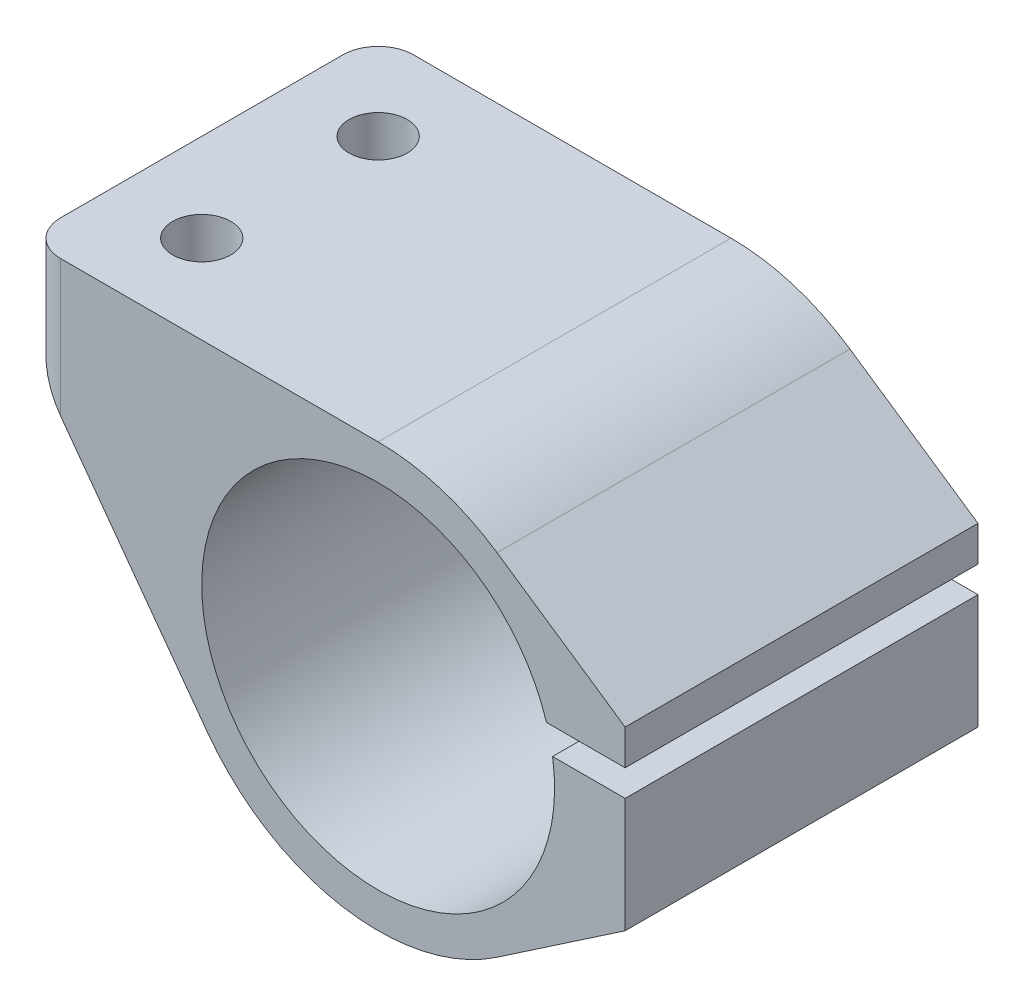
ISO-10303-21;
HEADER;
FILE_DESCRIPTION(('STEP AP214'),'2;1');
FILE_NAME('part.step','',(''),(''),'','','');
FILE_SCHEMA(('AUTOMOTIVE_DESIGN { 1 0 10303 214 1 1 1 1 }'));
ENDSEC;
DATA;
#1=APPLICATION_CONTEXT('core data for automotive mechanical design processes');
#2=APPLICATION_PROTOCOL_DEFINITION('international standard','automotive_design',2000,#1);
#3=PRODUCT_CONTEXT('',#1,'mechanical');
#4=PRODUCT('Part','Part','',(#3));
#5=PRODUCT_RELATED_PRODUCT_CATEGORY('part','',(#4));
#6=PRODUCT_DEFINITION_FORMATION('','',#4);
#7=PRODUCT_DEFINITION_CONTEXT('part definition',#1,'design');
#8=PRODUCT_DEFINITION('design','',#6,#7);
#9=PRODUCT_DEFINITION_SHAPE('','',#8);
#10=(LENGTH_UNIT() NAMED_UNIT(*) SI_UNIT(.MILLI.,.METRE.));
#11=(NAMED_UNIT(*) PLANE_ANGLE_UNIT() SI_UNIT($,.RADIAN.));
#12=(NAMED_UNIT(*) SI_UNIT($,.STERADIAN.) SOLID_ANGLE_UNIT());
#13=UNCERTAINTY_MEASURE_WITH_UNIT(LENGTH_MEASURE(1.E-05),#10,'distance_accuracy_value','');
#14=(GEOMETRIC_REPRESENTATION_CONTEXT(3) GLOBAL_UNCERTAINTY_ASSIGNED_CONTEXT((#13)) GLOBAL_UNIT_ASSIGNED_CONTEXT((#10,
#11,#12)) REPRESENTATION_CONTEXT('',''));
#15=CARTESIAN_POINT('',(0.,0.,0.));
#16=DIRECTION('',(0.,0.,1.));
#17=DIRECTION('',(1.,0.,0.));
#18=AXIS2_PLACEMENT_3D('',#15,#16,#17);
#19=CARTESIAN_POINT('',(0.,0.,20.));
#20=DIRECTION('',(0.,0.,-1.));
#21=DIRECTION('',(-1.,0.,0.));
#22=AXIS2_PLACEMENT_3D('',#19,#20,#21);
#23=CYLINDRICAL_SURFACE('',#22,12.);
#24=DIRECTION('',(0.,0.,1.));
#25=VECTOR('',#24,1.);
#26=CARTESIAN_POINT('',(0.,12.,0.));
#27=LINE('',#26,#25);
#28=CARTESIAN_POINT('',(0.,12.,0.));
#29=VERTEX_POINT('',#28);
#30=CARTESIAN_POINT('',(0.,12.,20.));
#31=VERTEX_POINT('',#30);
#32=EDGE_CURVE('E145',#29,#31,#27,.T.);
#33=ORIENTED_EDGE('',*,*,#32,.T.);
#34=CARTESIAN_POINT('',(0.,0.,20.));
#35=DIRECTION('',(0.,0.,1.));
#36=DIRECTION('',(1.,0.,0.));
#37=AXIS2_PLACEMENT_3D('',#34,#35,#36);
#38=CIRCLE('',#37,12.);
#39=CARTESIAN_POINT('',(6.73982867310621,9.92847971530261,20.));
#40=VERTEX_POINT('',#39);
#41=EDGE_CURVE('E172',#40,#31,#38,.T.);
#42=ORIENTED_EDGE('',*,*,#41,.F.);
#43=DIRECTION('',(0.,0.,-1.));
#44=VECTOR('',#43,1.);
#45=CARTESIAN_POINT('',(6.73982867310621,9.92847971530261,20.));
#46=LINE('',#45,#44);
#47=CARTESIAN_POINT('',(6.73982867310621,9.92847971530261,0.));
#48=VERTEX_POINT('',#47);
#49=EDGE_CURVE('E188',#40,#48,#46,.T.);
#50=ORIENTED_EDGE('',*,*,#49,.T.);
#51=CARTESIAN_POINT('',(0.,0.,0.));
#52=DIRECTION('',(0.,0.,1.));
#53=DIRECTION('',(1.,0.,0.));
#54=AXIS2_PLACEMENT_3D('',#51,#52,#53);
#55=CIRCLE('',#54,12.);
#56=EDGE_CURVE('E156',#48,#29,#55,.T.);
#57=ORIENTED_EDGE('',*,*,#56,.T.);
#58=EDGE_LOOP('',(#33,#42,#50,#57));
#59=FACE_BOUND('',#58,.T.);
#60=ADVANCED_FACE('F33',(#59),#23,.T.);
#61=CARTESIAN_POINT('',(-9.68150764479317,-7.09002184226618,20.));
#62=VERTEX_POINT('',#61);
#63=CARTESIAN_POINT('',(6.7398286731062,-9.92847971530261,20.));
#64=VERTEX_POINT('',#63);
#65=EDGE_CURVE('E160',#62,#64,#38,.T.);
#66=ORIENTED_EDGE('',*,*,#65,.F.);
#67=DIRECTION('',(0.,0.,1.));
#68=VECTOR('',#67,1.);
#69=CARTESIAN_POINT('',(-9.68150764479317,-7.09002184226618,0.));
#70=LINE('',#69,#68);
#71=CARTESIAN_POINT('',(-9.68150764479317,-7.09002184226618,0.));
#72=VERTEX_POINT('',#71);
#73=EDGE_CURVE('E143',#72,#62,#70,.T.);
#74=ORIENTED_EDGE('',*,*,#73,.F.);
#75=CARTESIAN_POINT('',(6.7398286731062,-9.92847971530261,0.));
#76=VERTEX_POINT('',#75);
#77=EDGE_CURVE('E149',#72,#76,#55,.T.);
#78=ORIENTED_EDGE('',*,*,#77,.T.);
#79=DIRECTION('',(0.,0.,-1.));
#80=VECTOR('',#79,1.);
#81=CARTESIAN_POINT('',(6.7398286731062,-9.92847971530261,20.));
#82=LINE('',#81,#80);
#83=EDGE_CURVE('E223',#64,#76,#82,.T.);
#84=ORIENTED_EDGE('',*,*,#83,.F.);
#85=EDGE_LOOP('',(#66,#74,#78,#84));
#86=FACE_BOUND('',#85,.T.);
#87=ADVANCED_FACE('F159',(#86),#23,.T.);
#88=CARTESIAN_POINT('',(6.7398286731062,-9.92847971530261,20.));
#89=DIRECTION('',(-0.561652389425518,0.827373309608551,0.));
#90=DIRECTION('',(-0.827373309608551,-0.561652389425518,0.));
#91=AXIS2_PLACEMENT_3D('',#88,#89,#90);
#92=PLANE('',#91);
#93=DIRECTION('',(0.827373309608551,0.561652389425518,0.));
#94=VECTOR('',#93,1.);
#95=CARTESIAN_POINT('',(6.7398286731062,-9.92847971530261,0.));
#96=LINE('',#95,#94);
#97=CARTESIAN_POINT('',(14.,-5.,0.));
#98=VERTEX_POINT('',#97);
#99=EDGE_CURVE('E152',#76,#98,#96,.T.);
#100=ORIENTED_EDGE('',*,*,#99,.T.);
#101=DIRECTION('',(0.,0.,-1.));
#102=VECTOR('',#101,1.);
#103=CARTESIAN_POINT('',(14.,-5.,20.));
#104=LINE('',#103,#102);
#105=CARTESIAN_POINT('',(14.,-5.,20.));
#106=VERTEX_POINT('',#105);
#107=EDGE_CURVE('E220',#106,#98,#104,.T.);
#108=ORIENTED_EDGE('',*,*,#107,.F.);
#109=DIRECTION('',(0.827373309608551,0.561652389425518,0.));
#110=VECTOR('',#109,1.);
#111=CARTESIAN_POINT('',(6.7398286731062,-9.92847971530261,20.));
#112=LINE('',#111,#110);
#113=EDGE_CURVE('E175',#64,#106,#112,.T.);
#114=ORIENTED_EDGE('',*,*,#113,.F.);
#115=ORIENTED_EDGE('',*,*,#83,.T.);
#116=EDGE_LOOP('',(#100,#108,#114,#115));
#117=FACE_BOUND('',#116,.T.);
#118=ADVANCED_FACE('F260',(#117),#92,.F.);
#119=CARTESIAN_POINT('',(14.,-5.,20.));
#120=DIRECTION('',(-1.,0.,0.));
#121=DIRECTION('',(0.,0.,1.));
#122=AXIS2_PLACEMENT_3D('',#119,#120,#121);
#123=PLANE('',#122);
#124=DIRECTION('',(0.,1.,0.));
#125=VECTOR('',#124,1.);
#126=CARTESIAN_POINT('',(14.,-5.,0.));
#127=LINE('',#126,#125);
#128=CARTESIAN_POINT('',(14.,1.5,0.));
#129=VERTEX_POINT('',#128);
#130=EDGE_CURVE('E191',#98,#129,#127,.T.);
#131=ORIENTED_EDGE('',*,*,#130,.T.);
#132=DIRECTION('',(0.,0.,-1.));
#133=VECTOR('',#132,1.);
#134=CARTESIAN_POINT('',(14.,1.5,20.));
#135=LINE('',#134,#133);
#136=CARTESIAN_POINT('',(14.,1.5,20.));
#137=VERTEX_POINT('',#136);
#138=EDGE_CURVE('E217',#137,#129,#135,.T.);
#139=ORIENTED_EDGE('',*,*,#138,.F.);
#140=DIRECTION('',(0.,1.,0.));
#141=VECTOR('',#140,1.);
#142=CARTESIAN_POINT('',(14.,-5.,20.));
#143=LINE('',#142,#141);
#144=EDGE_CURVE('E177',#106,#137,#143,.T.);
#145=ORIENTED_EDGE('',*,*,#144,.F.);
#146=ORIENTED_EDGE('',*,*,#107,.T.);
#147=EDGE_LOOP('',(#131,#139,#145,#146));
#148=FACE_BOUND('',#147,.T.);
#149=ADVANCED_FACE('F264',(#148),#123,.F.);
#150=CARTESIAN_POINT('',(14.,1.5,20.));
#151=DIRECTION('',(0.,-1.,0.));
#152=DIRECTION('',(1.,0.,0.));
#153=AXIS2_PLACEMENT_3D('',#150,#151,#152);
#154=PLANE('',#153);
#155=DIRECTION('',(-1.,0.,0.));
#156=VECTOR('',#155,1.);
#157=CARTESIAN_POINT('',(14.,1.5,0.));
#158=LINE('',#157,#156);
#159=CARTESIAN_POINT('',(9.88685996664259,1.5,0.));
#160=VERTEX_POINT('',#159);
#161=EDGE_CURVE('E193',#129,#160,#158,.T.);
#162=ORIENTED_EDGE('',*,*,#161,.T.);
#163=DIRECTION('',(0.,0.,-1.));
#164=VECTOR('',#163,1.);
#165=CARTESIAN_POINT('',(9.88685996664259,1.5,20.));
#166=LINE('',#165,#164);
#167=CARTESIAN_POINT('',(9.88685996664259,1.5,20.));
#168=VERTEX_POINT('',#167);
#169=EDGE_CURVE('E214',#168,#160,#166,.T.);
#170=ORIENTED_EDGE('',*,*,#169,.F.);
#171=DIRECTION('',(-1.,0.,0.));
#172=VECTOR('',#171,1.);
#173=CARTESIAN_POINT('',(14.,1.5,20.));
#174=LINE('',#173,#172);
#175=EDGE_CURVE('E179',#137,#168,#174,.T.);
#176=ORIENTED_EDGE('',*,*,#175,.F.);
#177=ORIENTED_EDGE('',*,*,#138,.T.);
#178=EDGE_LOOP('',(#162,#170,#176,#177));
#179=FACE_BOUND('',#178,.T.);
#180=ADVANCED_FACE('F268',(#179),#154,.F.);
#181=CARTESIAN_POINT('',(0.,0.,20.));
#182=DIRECTION('',(0.,0.,-1.));
#183=DIRECTION('',(-1.,0.,0.));
#184=AXIS2_PLACEMENT_3D('',#181,#182,#183);
#185=CYLINDRICAL_SURFACE('',#184,10.);
#186=CARTESIAN_POINT('',(0.,0.,0.));
#187=DIRECTION('',(0.,0.,-1.));
#188=DIRECTION('',(1.,0.,0.));
#189=AXIS2_PLACEMENT_3D('',#186,#187,#188);
#190=CIRCLE('',#189,10.);
#191=CARTESIAN_POINT('',(9.53939201416946,3.,0.));
#192=VERTEX_POINT('',#191);
#193=EDGE_CURVE('E195',#160,#192,#190,.T.);
#194=ORIENTED_EDGE('',*,*,#193,.T.);
#195=DIRECTION('',(0.,0.,-1.));
#196=VECTOR('',#195,1.);
#197=CARTESIAN_POINT('',(9.53939201416946,3.,20.));
#198=LINE('',#197,#196);
#199=CARTESIAN_POINT('',(9.53939201416946,3.,20.));
#200=VERTEX_POINT('',#199);
#201=EDGE_CURVE('E211',#200,#192,#198,.T.);
#202=ORIENTED_EDGE('',*,*,#201,.F.);
#203=CARTESIAN_POINT('',(0.,0.,20.));
#204=DIRECTION('',(0.,0.,-1.));
#205=DIRECTION('',(1.,0.,0.));
#206=AXIS2_PLACEMENT_3D('',#203,#204,#205);
#207=CIRCLE('',#206,10.);
#208=EDGE_CURVE('E181',#168,#200,#207,.T.);
#209=ORIENTED_EDGE('',*,*,#208,.F.);
#210=ORIENTED_EDGE('',*,*,#169,.T.);
#211=EDGE_LOOP('',(#194,#202,#209,#210));
#212=FACE_BOUND('',#211,.T.);
#213=ADVANCED_FACE('F272',(#212),#185,.F.);
#214=CARTESIAN_POINT('',(9.53939201416946,3.,20.));
#215=DIRECTION('',(0.,1.,0.));
#216=DIRECTION('',(-1.,0.,0.));
#217=AXIS2_PLACEMENT_3D('',#214,#215,#216);
#218=PLANE('',#217);
#219=DIRECTION('',(1.,0.,0.));
#220=VECTOR('',#219,1.);
#221=CARTESIAN_POINT('',(9.53939201416946,3.,0.));
#222=LINE('',#221,#220);
#223=CARTESIAN_POINT('',(14.,3.,0.));
#224=VERTEX_POINT('',#223);
#225=EDGE_CURVE('E197',#192,#224,#222,.T.);
#226=ORIENTED_EDGE('',*,*,#225,.T.);
#227=DIRECTION('',(0.,0.,-1.));
#228=VECTOR('',#227,1.);
#229=CARTESIAN_POINT('',(14.,3.,20.));
#230=LINE('',#229,#228);
#231=CARTESIAN_POINT('',(14.,3.,20.));
#232=VERTEX_POINT('',#231);
#233=EDGE_CURVE('E208',#232,#224,#230,.T.);
#234=ORIENTED_EDGE('',*,*,#233,.F.);
#235=DIRECTION('',(1.,0.,0.));
#236=VECTOR('',#235,1.);
#237=CARTESIAN_POINT('',(9.53939201416946,3.,20.));
#238=LINE('',#237,#236);
#239=EDGE_CURVE('E183',#200,#232,#238,.T.);
#240=ORIENTED_EDGE('',*,*,#239,.F.);
#241=ORIENTED_EDGE('',*,*,#201,.T.);
#242=EDGE_LOOP('',(#226,#234,#240,#241));
#243=FACE_BOUND('',#242,.T.);
#244=ADVANCED_FACE('F276',(#243),#218,.F.);
#245=CARTESIAN_POINT('',(14.,3.,20.));
#246=DIRECTION('',(-1.,0.,0.));
#247=DIRECTION('',(0.,0.,1.));
#248=AXIS2_PLACEMENT_3D('',#245,#246,#247);
#249=PLANE('',#248);
#250=DIRECTION('',(0.,1.,0.));
#251=VECTOR('',#250,1.);
#252=CARTESIAN_POINT('',(14.,3.,0.));
#253=LINE('',#252,#251);
#254=CARTESIAN_POINT('',(14.,5.,0.));
#255=VERTEX_POINT('',#254);
#256=EDGE_CURVE('E199',#224,#255,#253,.T.);
#257=ORIENTED_EDGE('',*,*,#256,.T.);
#258=DIRECTION('',(0.,0.,-1.));
#259=VECTOR('',#258,1.);
#260=CARTESIAN_POINT('',(14.,5.,20.));
#261=LINE('',#260,#259);
#262=CARTESIAN_POINT('',(14.,5.,20.));
#263=VERTEX_POINT('',#262);
#264=EDGE_CURVE('E205',#263,#255,#261,.T.);
#265=ORIENTED_EDGE('',*,*,#264,.F.);
#266=DIRECTION('',(0.,1.,0.));
#267=VECTOR('',#266,1.);
#268=CARTESIAN_POINT('',(14.,3.,20.));
#269=LINE('',#268,#267);
#270=EDGE_CURVE('E185',#232,#263,#269,.T.);
#271=ORIENTED_EDGE('',*,*,#270,.F.);
#272=ORIENTED_EDGE('',*,*,#233,.T.);
#273=EDGE_LOOP('',(#257,#265,#271,#272));
#274=FACE_BOUND('',#273,.T.);
#275=ADVANCED_FACE('F280',(#274),#249,.F.);
#276=CARTESIAN_POINT('',(14.,5.,20.));
#277=DIRECTION('',(-0.561652389425517,-0.827373309608551,0.));
#278=DIRECTION('',(0.827373309608551,-0.561652389425517,0.));
#279=AXIS2_PLACEMENT_3D('',#276,#277,#278);
#280=PLANE('',#279);
#281=DIRECTION('',(-0.827373309608551,0.561652389425517,0.));
#282=VECTOR('',#281,1.);
#283=CARTESIAN_POINT('',(14.,5.,0.));
#284=LINE('',#283,#282);
#285=EDGE_CURVE('E201',#255,#48,#284,.T.);
#286=ORIENTED_EDGE('',*,*,#285,.T.);
#287=ORIENTED_EDGE('',*,*,#49,.F.);
#288=DIRECTION('',(-0.827373309608551,0.561652389425517,0.));
#289=VECTOR('',#288,1.);
#290=CARTESIAN_POINT('',(14.,5.,20.));
#291=LINE('',#290,#289);
#292=EDGE_CURVE('E187',#263,#40,#291,.T.);
#293=ORIENTED_EDGE('',*,*,#292,.F.);
#294=ORIENTED_EDGE('',*,*,#264,.T.);
#295=EDGE_LOOP('',(#286,#287,#293,#294));
#296=FACE_BOUND('',#295,.T.);
#297=ADVANCED_FACE('F284',(#296),#280,.F.);
#298=CARTESIAN_POINT('',(0.,0.,20.));
#299=DIRECTION('',(0.,0.,1.));
#300=DIRECTION('',(1.,0.,0.));
#301=AXIS2_PLACEMENT_3D('',#298,#299,#300);
#302=PLANE('',#301);
#303=DIRECTION('',(-1.,0.,0.));
#304=VECTOR('',#303,1.);
#305=CARTESIAN_POINT('',(0.,12.,20.));
#306=LINE('',#305,#304);
#307=CARTESIAN_POINT('',(-18.,12.,20.));
#308=VERTEX_POINT('',#307);
#309=EDGE_CURVE('E324',#31,#308,#306,.T.);
#310=ORIENTED_EDGE('',*,*,#309,.T.);
#311=DIRECTION('',(0.,-1.,0.));
#312=VECTOR('',#311,1.);
#313=CARTESIAN_POINT('',(-18.,0.,20.));
#314=LINE('',#313,#312);
#315=CARTESIAN_POINT('',(-18.,4.26897663782128,20.));
#316=VERTEX_POINT('',#315);
#317=EDGE_CURVE('E11',#308,#316,#314,.T.);
#318=ORIENTED_EDGE('',*,*,#317,.T.);
#319=DIRECTION('',(0.590835153522182,-0.806792303732764,0.));
#320=VECTOR('',#319,1.);
#321=CARTESIAN_POINT('',(-20.,7.,20.));
#322=LINE('',#321,#320);
#323=EDGE_CURVE('E167',#316,#62,#322,.T.);
#324=ORIENTED_EDGE('',*,*,#323,.T.);
#325=ORIENTED_EDGE('',*,*,#65,.T.);
#326=ORIENTED_EDGE('',*,*,#113,.T.);
#327=ORIENTED_EDGE('',*,*,#144,.T.);
#328=ORIENTED_EDGE('',*,*,#175,.T.);
#329=ORIENTED_EDGE('',*,*,#208,.T.);
#330=ORIENTED_EDGE('',*,*,#239,.T.);
#331=ORIENTED_EDGE('',*,*,#270,.T.);
#332=ORIENTED_EDGE('',*,*,#292,.T.);
#333=ORIENTED_EDGE('',*,*,#41,.T.);
#334=EDGE_LOOP('',(#310,#318,#324,#325,#326,#327,#328,#329,#330,#331,#332,#333));
#335=FACE_BOUND('',#334,.T.);
#336=ADVANCED_FACE('F288',(#335),#302,.T.);
#337=CARTESIAN_POINT('',(0.,0.,0.));
#338=DIRECTION('',(0.,0.,1.));
#339=DIRECTION('',(1.,0.,0.));
#340=AXIS2_PLACEMENT_3D('',#337,#338,#339);
#341=PLANE('',#340);
#342=DIRECTION('',(0.590835153522182,-0.806792303732764,0.));
#343=VECTOR('',#342,1.);
#344=CARTESIAN_POINT('',(-20.,7.,0.));
#345=LINE('',#344,#343);
#346=CARTESIAN_POINT('',(-18.,4.26897663782128,0.));
#347=VERTEX_POINT('',#346);
#348=EDGE_CURVE('E137',#347,#72,#345,.T.);
#349=ORIENTED_EDGE('',*,*,#348,.F.);
#350=DIRECTION('',(0.,-1.,0.));
#351=VECTOR('',#350,1.);
#352=CARTESIAN_POINT('',(-18.,12.,0.));
#353=LINE('',#352,#351);
#354=CARTESIAN_POINT('',(-18.,12.,0.));
#355=VERTEX_POINT('',#354);
#356=EDGE_CURVE('E56',#347,#355,#353,.F.);
#357=ORIENTED_EDGE('',*,*,#356,.T.);
#358=DIRECTION('',(-1.,0.,0.));
#359=VECTOR('',#358,1.);
#360=CARTESIAN_POINT('',(0.,12.,0.));
#361=LINE('',#360,#359);
#362=EDGE_CURVE('E146',#29,#355,#361,.T.);
#363=ORIENTED_EDGE('',*,*,#362,.F.);
#364=ORIENTED_EDGE('',*,*,#56,.F.);
#365=ORIENTED_EDGE('',*,*,#285,.F.);
#366=ORIENTED_EDGE('',*,*,#256,.F.);
#367=ORIENTED_EDGE('',*,*,#225,.F.);
#368=ORIENTED_EDGE('',*,*,#193,.F.);
#369=ORIENTED_EDGE('',*,*,#161,.F.);
#370=ORIENTED_EDGE('',*,*,#130,.F.);
#371=ORIENTED_EDGE('',*,*,#99,.F.);
#372=ORIENTED_EDGE('',*,*,#77,.F.);
#373=EDGE_LOOP('',(#349,#357,#363,#364,#365,#366,#367,#368,#369,#370,#371,#372));
#374=FACE_BOUND('',#373,.T.);
#375=ADVANCED_FACE('F150',(#374),#341,.F.);
#376=CARTESIAN_POINT('',(-20.,7.,0.));
#377=DIRECTION('',(-0.806792303732764,-0.590835153522182,0.));
#378=DIRECTION('',(0.590835153522182,-0.806792303732764,0.));
#379=AXIS2_PLACEMENT_3D('',#376,#377,#378);
#380=PLANE('',#379);
#381=CARTESIAN_POINT('',(-15.,0.172441594553206,5.));
#382=DIRECTION('',(-0.806792303732764,-0.590835153522182,0.));
#383=DIRECTION('',(-0.590835153522182,0.806792303732764,0.));
#384=AXIS2_PLACEMENT_3D('',#381,#382,#383);
#385=ELLIPSE('',#384,2.79265712299574,1.65);
#386=CARTESIAN_POINT('',(-16.65,2.42553586835065,5.));
#387=VERTEX_POINT('',#386);
#388=EDGE_CURVE('E321',#387,#387,#385,.T.);
#389=ORIENTED_EDGE('',*,*,#388,.F.);
#390=EDGE_LOOP('',(#389));
#391=FACE_BOUND('',#390,.T.);
#392=CARTESIAN_POINT('',(-15.,0.172441594553206,15.));
#393=DIRECTION('',(-0.806792303732764,-0.590835153522182,0.));
#394=DIRECTION('',(-0.590835153522182,0.806792303732764,0.));
#395=AXIS2_PLACEMENT_3D('',#392,#393,#394);
#396=ELLIPSE('',#395,2.79265712299574,1.65);
#397=CARTESIAN_POINT('',(-16.65,2.42553586835065,15.));
#398=VERTEX_POINT('',#397);
#399=EDGE_CURVE('E310',#398,#398,#396,.T.);
#400=ORIENTED_EDGE('',*,*,#399,.F.);
#401=EDGE_LOOP('',(#400));
#402=FACE_BOUND('',#401,.T.);
#403=DIRECTION('',(0.,0.,1.));
#404=VECTOR('',#403,1.);
#405=CARTESIAN_POINT('',(-20.,7.,0.));
#406=LINE('',#405,#404);
#407=CARTESIAN_POINT('',(-20.,7.,2.));
#408=VERTEX_POINT('',#407);
#409=CARTESIAN_POINT('',(-20.,7.,18.));
#410=VERTEX_POINT('',#409);
#411=EDGE_CURVE('E161',#408,#410,#406,.T.);
#412=ORIENTED_EDGE('',*,*,#411,.F.);
#413=CARTESIAN_POINT('',(-18.,4.26897663782128,2.));
#414=DIRECTION('',(-0.806792303732764,-0.590835153522182,0.));
#415=DIRECTION('',(-0.590835153522182,0.806792303732764,0.));
#416=AXIS2_PLACEMENT_3D('',#413,#414,#415);
#417=ELLIPSE('',#416,3.38503893696453,2.);
#418=EDGE_CURVE('E144',#408,#347,#417,.T.);
#419=ORIENTED_EDGE('',*,*,#418,.T.);
#420=ORIENTED_EDGE('',*,*,#348,.T.);
#421=ORIENTED_EDGE('',*,*,#73,.T.);
#422=ORIENTED_EDGE('',*,*,#323,.F.);
#423=CARTESIAN_POINT('',(-18.,4.26897663782128,18.));
#424=DIRECTION('',(-0.806792303732764,-0.590835153522182,0.));
#425=DIRECTION('',(0.590835153522182,-0.806792303732764,0.));
#426=AXIS2_PLACEMENT_3D('',#423,#424,#425);
#427=ELLIPSE('',#426,3.38503893696453,2.);
#428=EDGE_CURVE('E230',#316,#410,#427,.T.);
#429=ORIENTED_EDGE('',*,*,#428,.T.);
#430=EDGE_LOOP('',(#412,#419,#420,#421,#422,#429));
#431=FACE_BOUND('',#430,.T.);
#432=ADVANCED_FACE('F140',(#391,#402,#431),#380,.T.);
#433=CARTESIAN_POINT('',(-20.,12.,0.));
#434=DIRECTION('',(-1.,0.,0.));
#435=DIRECTION('',(0.,0.,1.));
#436=AXIS2_PLACEMENT_3D('',#433,#434,#435);
#437=PLANE('',#436);
#438=DIRECTION('',(0.,0.,1.));
#439=VECTOR('',#438,1.);
#440=CARTESIAN_POINT('',(-20.,12.,0.));
#441=LINE('',#440,#439);
#442=CARTESIAN_POINT('',(-20.,12.,2.));
#443=VERTEX_POINT('',#442);
#444=CARTESIAN_POINT('',(-20.,12.,18.));
#445=VERTEX_POINT('',#444);
#446=EDGE_CURVE('E164',#443,#445,#441,.T.);
#447=ORIENTED_EDGE('',*,*,#446,.F.);
#448=DIRECTION('',(0.,-1.,0.));
#449=VECTOR('',#448,1.);
#450=CARTESIAN_POINT('',(-20.,7.,2.));
#451=LINE('',#450,#449);
#452=EDGE_CURVE('E227',#443,#408,#451,.T.);
#453=ORIENTED_EDGE('',*,*,#452,.T.);
#454=ORIENTED_EDGE('',*,*,#411,.T.);
#455=DIRECTION('',(0.,-1.,0.));
#456=VECTOR('',#455,1.);
#457=CARTESIAN_POINT('',(-20.,12.,18.));
#458=LINE('',#457,#456);
#459=EDGE_CURVE('E225',#410,#445,#458,.F.);
#460=ORIENTED_EDGE('',*,*,#459,.T.);
#461=EDGE_LOOP('',(#447,#453,#454,#460));
#462=FACE_BOUND('',#461,.T.);
#463=ADVANCED_FACE('F241',(#462),#437,.T.);
#464=CARTESIAN_POINT('',(0.,12.,0.));
#465=DIRECTION('',(0.,1.,0.));
#466=DIRECTION('',(-1.,0.,0.));
#467=AXIS2_PLACEMENT_3D('',#464,#465,#466);
#468=PLANE('',#467);
#469=CARTESIAN_POINT('',(-15.,12.,5.));
#470=DIRECTION('',(0.,1.,0.));
#471=DIRECTION('',(-1.,0.,0.));
#472=AXIS2_PLACEMENT_3D('',#469,#470,#471);
#473=CIRCLE('',#472,1.65);
#474=CARTESIAN_POINT('',(-16.65,12.,5.));
#475=VERTEX_POINT('',#474);
#476=EDGE_CURVE('E315',#475,#475,#473,.T.);
#477=ORIENTED_EDGE('',*,*,#476,.F.);
#478=EDGE_LOOP('',(#477));
#479=FACE_BOUND('',#478,.T.);
#480=CARTESIAN_POINT('',(-15.,12.,15.));
#481=DIRECTION('',(0.,1.,0.));
#482=DIRECTION('',(-1.,0.,0.));
#483=AXIS2_PLACEMENT_3D('',#480,#481,#482);
#484=CIRCLE('',#483,1.65);
#485=CARTESIAN_POINT('',(-16.65,12.,15.));
#486=VERTEX_POINT('',#485);
#487=EDGE_CURVE('E313',#486,#486,#484,.T.);
#488=ORIENTED_EDGE('',*,*,#487,.F.);
#489=EDGE_LOOP('',(#488));
#490=FACE_BOUND('',#489,.T.);
#491=ORIENTED_EDGE('',*,*,#362,.T.);
#492=CARTESIAN_POINT('',(-18.,12.,2.));
#493=DIRECTION('',(0.,1.,0.));
#494=DIRECTION('',(-1.,0.,0.));
#495=AXIS2_PLACEMENT_3D('',#492,#493,#494);
#496=CIRCLE('',#495,2.);
#497=EDGE_CURVE('E41',#355,#443,#496,.T.);
#498=ORIENTED_EDGE('',*,*,#497,.T.);
#499=ORIENTED_EDGE('',*,*,#446,.T.);
#500=CARTESIAN_POINT('',(-18.,12.,18.));
#501=DIRECTION('',(0.,1.,0.));
#502=DIRECTION('',(-1.,0.,0.));
#503=AXIS2_PLACEMENT_3D('',#500,#501,#502);
#504=CIRCLE('',#503,2.);
#505=EDGE_CURVE('E48',#445,#308,#504,.T.);
#506=ORIENTED_EDGE('',*,*,#505,.T.);
#507=ORIENTED_EDGE('',*,*,#309,.F.);
#508=ORIENTED_EDGE('',*,*,#32,.F.);
#509=EDGE_LOOP('',(#491,#498,#499,#506,#507,#508));
#510=FACE_BOUND('',#509,.T.);
#511=ADVANCED_FACE('F236',(#479,#490,#510),#468,.T.);
#512=CARTESIAN_POINT('',(-15.,-12.,15.));
#513=DIRECTION('',(0.,1.,0.));
#514=DIRECTION('',(-1.,0.,0.));
#515=AXIS2_PLACEMENT_3D('',#512,#513,#514);
#516=CYLINDRICAL_SURFACE('',#515,1.65);
#517=ORIENTED_EDGE('',*,*,#399,.T.);
#518=EDGE_LOOP('',(#517));
#519=FACE_BOUND('',#518,.T.);
#520=ORIENTED_EDGE('',*,*,#487,.T.);
#521=EDGE_LOOP('',(#520));
#522=FACE_BOUND('',#521,.T.);
#523=ADVANCED_FACE('F251',(#519,#522),#516,.F.);
#524=CARTESIAN_POINT('',(-15.,-12.,5.));
#525=DIRECTION('',(0.,1.,0.));
#526=DIRECTION('',(-1.,0.,0.));
#527=AXIS2_PLACEMENT_3D('',#524,#525,#526);
#528=CYLINDRICAL_SURFACE('',#527,1.65);
#529=ORIENTED_EDGE('',*,*,#388,.T.);
#530=EDGE_LOOP('',(#529));
#531=FACE_BOUND('',#530,.T.);
#532=ORIENTED_EDGE('',*,*,#476,.T.);
#533=EDGE_LOOP('',(#532));
#534=FACE_BOUND('',#533,.T.);
#535=ADVANCED_FACE('F245',(#531,#534),#528,.F.);
#536=CARTESIAN_POINT('',(-18.,12.,2.));
#537=DIRECTION('',(0.,1.,0.));
#538=DIRECTION('',(0.,0.,1.));
#539=AXIS2_PLACEMENT_3D('',#536,#537,#538);
#540=CYLINDRICAL_SURFACE('',#539,2.);
#541=ORIENTED_EDGE('',*,*,#497,.F.);
#542=ORIENTED_EDGE('',*,*,#356,.F.);
#543=ORIENTED_EDGE('',*,*,#418,.F.);
#544=ORIENTED_EDGE('',*,*,#452,.F.);
#545=EDGE_LOOP('',(#541,#542,#543,#544));
#546=FACE_BOUND('',#545,.T.);
#547=ADVANCED_FACE('F243',(#546),#540,.T.);
#548=CARTESIAN_POINT('',(-18.,0.,18.));
#549=DIRECTION('',(0.,-1.,0.));
#550=DIRECTION('',(0.,0.,-1.));
#551=AXIS2_PLACEMENT_3D('',#548,#549,#550);
#552=CYLINDRICAL_SURFACE('',#551,2.);
#553=ORIENTED_EDGE('',*,*,#505,.F.);
#554=ORIENTED_EDGE('',*,*,#459,.F.);
#555=ORIENTED_EDGE('',*,*,#428,.F.);
#556=ORIENTED_EDGE('',*,*,#317,.F.);
#557=EDGE_LOOP('',(#553,#554,#555,#556));
#558=FACE_BOUND('',#557,.T.);
#559=ADVANCED_FACE('F35',(#558),#552,.T.);
#560=CLOSED_SHELL('',(#60,#87,#118,#149,#180,#213,#244,#275,#297,#336,#375,#432,#463,#511,#523,
#535,#547,#559));
#561=MANIFOLD_SOLID_BREP('B2',#560);
#562=ADVANCED_BREP_SHAPE_REPRESENTATION('',(#18,#561),#14);
#563=SHAPE_DEFINITION_REPRESENTATION(#9,#562);
ENDSEC;
END-ISO-10303-21;
